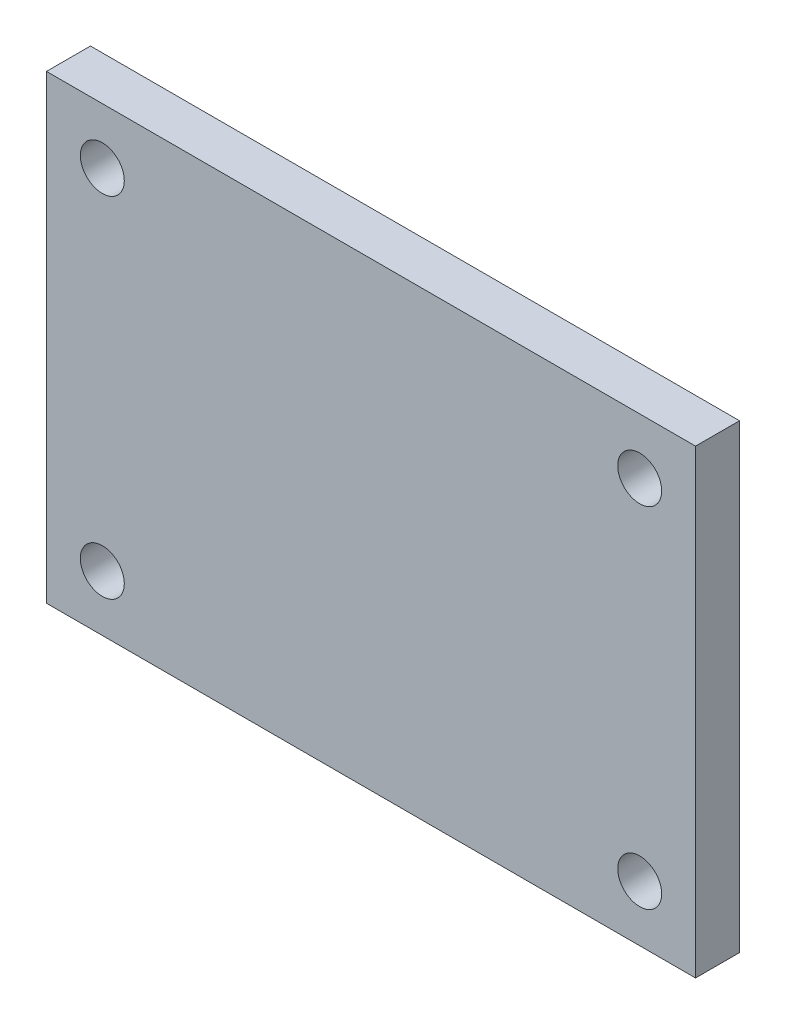
ISO-10303-21;
HEADER;
FILE_DESCRIPTION(('STEP AP214'),'2;1');
FILE_NAME('part.step','',(''),(''),'','','');
FILE_SCHEMA(('AUTOMOTIVE_DESIGN { 1 0 10303 214 1 1 1 1 }'));
ENDSEC;
DATA;
#1=APPLICATION_CONTEXT('core data for automotive mechanical design processes');
#2=APPLICATION_PROTOCOL_DEFINITION('international standard','automotive_design',2000,#1);
#3=PRODUCT_CONTEXT('',#1,'mechanical');
#4=PRODUCT('Part','Part','',(#3));
#5=PRODUCT_RELATED_PRODUCT_CATEGORY('part','',(#4));
#6=PRODUCT_DEFINITION_FORMATION('','',#4);
#7=PRODUCT_DEFINITION_CONTEXT('part definition',#1,'design');
#8=PRODUCT_DEFINITION('design','',#6,#7);
#9=PRODUCT_DEFINITION_SHAPE('','',#8);
#10=(LENGTH_UNIT() NAMED_UNIT(*) SI_UNIT(.MILLI.,.METRE.));
#11=(NAMED_UNIT(*) PLANE_ANGLE_UNIT() SI_UNIT($,.RADIAN.));
#12=(NAMED_UNIT(*) SI_UNIT($,.STERADIAN.) SOLID_ANGLE_UNIT());
#13=UNCERTAINTY_MEASURE_WITH_UNIT(LENGTH_MEASURE(1.E-05),#10,'distance_accuracy_value','');
#14=(GEOMETRIC_REPRESENTATION_CONTEXT(3) GLOBAL_UNCERTAINTY_ASSIGNED_CONTEXT((#13)) GLOBAL_UNIT_ASSIGNED_CONTEXT((#10,
#11,#12)) REPRESENTATION_CONTEXT('',''));
#15=CARTESIAN_POINT('',(0.,0.,0.));
#16=DIRECTION('',(0.,0.,1.));
#17=DIRECTION('',(1.,0.,0.));
#18=AXIS2_PLACEMENT_3D('',#15,#16,#17);
#19=CARTESIAN_POINT('',(0.,0.,3.2));
#20=DIRECTION('',(1.,0.,0.));
#21=DIRECTION('',(0.,0.,-1.));
#22=AXIS2_PLACEMENT_3D('',#19,#20,#21);
#23=PLANE('',#22);
#24=DIRECTION('',(0.,-1.,0.));
#25=VECTOR('',#24,1.);
#26=CARTESIAN_POINT('',(0.,0.,0.));
#27=LINE('',#26,#25);
#28=CARTESIAN_POINT('',(0.,33.528,0.));
#29=VERTEX_POINT('',#28);
#30=CARTESIAN_POINT('',(0.,0.,0.));
#31=VERTEX_POINT('',#30);
#32=EDGE_CURVE('E99',#29,#31,#27,.T.);
#33=ORIENTED_EDGE('',*,*,#32,.T.);
#34=DIRECTION('',(0.,0.,-1.));
#35=VECTOR('',#34,1.);
#36=CARTESIAN_POINT('',(0.,0.,3.2));
#37=LINE('',#36,#35);
#38=CARTESIAN_POINT('',(0.,0.,3.2));
#39=VERTEX_POINT('',#38);
#40=EDGE_CURVE('E11',#39,#31,#37,.T.);
#41=ORIENTED_EDGE('',*,*,#40,.F.);
#42=DIRECTION('',(0.,-1.,0.));
#43=VECTOR('',#42,1.);
#44=CARTESIAN_POINT('',(0.,0.,3.2));
#45=LINE('',#44,#43);
#46=CARTESIAN_POINT('',(0.,33.528,3.2));
#47=VERTEX_POINT('',#46);
#48=EDGE_CURVE('E87',#47,#39,#45,.T.);
#49=ORIENTED_EDGE('',*,*,#48,.F.);
#50=DIRECTION('',(0.,0.,-1.));
#51=VECTOR('',#50,1.);
#52=CARTESIAN_POINT('',(0.,33.528,3.2));
#53=LINE('',#52,#51);
#54=EDGE_CURVE('E95',#47,#29,#53,.T.);
#55=ORIENTED_EDGE('',*,*,#54,.T.);
#56=EDGE_LOOP('',(#33,#41,#49,#55));
#57=FACE_BOUND('',#56,.T.);
#58=ADVANCED_FACE('F36',(#57),#23,.F.);
#59=CARTESIAN_POINT('',(0.,0.,3.2));
#60=DIRECTION('',(0.,1.,0.));
#61=DIRECTION('',(0.,0.,1.));
#62=AXIS2_PLACEMENT_3D('',#59,#60,#61);
#63=PLANE('',#62);
#64=DIRECTION('',(1.,0.,0.));
#65=VECTOR('',#64,1.);
#66=CARTESIAN_POINT('',(0.,0.,0.));
#67=LINE('',#66,#65);
#68=CARTESIAN_POINT('',(47.244,0.,0.));
#69=VERTEX_POINT('',#68);
#70=EDGE_CURVE('E91',#31,#69,#67,.T.);
#71=ORIENTED_EDGE('',*,*,#70,.T.);
#72=DIRECTION('',(0.,0.,-1.));
#73=VECTOR('',#72,1.);
#74=CARTESIAN_POINT('',(47.244,0.,3.2));
#75=LINE('',#74,#73);
#76=CARTESIAN_POINT('',(47.244,0.,3.2));
#77=VERTEX_POINT('',#76);
#78=EDGE_CURVE('E44',#77,#69,#75,.T.);
#79=ORIENTED_EDGE('',*,*,#78,.F.);
#80=DIRECTION('',(1.,0.,0.));
#81=VECTOR('',#80,1.);
#82=CARTESIAN_POINT('',(0.,0.,3.2));
#83=LINE('',#82,#81);
#84=EDGE_CURVE('E82',#39,#77,#83,.T.);
#85=ORIENTED_EDGE('',*,*,#84,.F.);
#86=ORIENTED_EDGE('',*,*,#40,.T.);
#87=EDGE_LOOP('',(#71,#79,#85,#86));
#88=FACE_BOUND('',#87,.T.);
#89=ADVANCED_FACE('F90',(#88),#63,.F.);
#90=CARTESIAN_POINT('',(47.244,0.,3.2));
#91=DIRECTION('',(-1.,0.,0.));
#92=DIRECTION('',(0.,0.,1.));
#93=AXIS2_PLACEMENT_3D('',#90,#91,#92);
#94=PLANE('',#93);
#95=DIRECTION('',(0.,1.,0.));
#96=VECTOR('',#95,1.);
#97=CARTESIAN_POINT('',(47.244,0.,0.));
#98=LINE('',#97,#96);
#99=CARTESIAN_POINT('',(47.244,33.528,0.));
#100=VERTEX_POINT('',#99);
#101=EDGE_CURVE('E69',#69,#100,#98,.T.);
#102=ORIENTED_EDGE('',*,*,#101,.T.);
#103=DIRECTION('',(0.,0.,-1.));
#104=VECTOR('',#103,1.);
#105=CARTESIAN_POINT('',(47.244,33.528,3.2));
#106=LINE('',#105,#104);
#107=CARTESIAN_POINT('',(47.244,33.528,3.2));
#108=VERTEX_POINT('',#107);
#109=EDGE_CURVE('E92',#108,#100,#106,.T.);
#110=ORIENTED_EDGE('',*,*,#109,.F.);
#111=DIRECTION('',(0.,1.,0.));
#112=VECTOR('',#111,1.);
#113=CARTESIAN_POINT('',(47.244,0.,3.2));
#114=LINE('',#113,#112);
#115=EDGE_CURVE('E85',#77,#108,#114,.T.);
#116=ORIENTED_EDGE('',*,*,#115,.F.);
#117=ORIENTED_EDGE('',*,*,#78,.T.);
#118=EDGE_LOOP('',(#102,#110,#116,#117));
#119=FACE_BOUND('',#118,.T.);
#120=ADVANCED_FACE('F93',(#119),#94,.F.);
#121=CARTESIAN_POINT('',(0.,33.528,3.2));
#122=DIRECTION('',(0.,-1.,0.));
#123=DIRECTION('',(0.,0.,-1.));
#124=AXIS2_PLACEMENT_3D('',#121,#122,#123);
#125=PLANE('',#124);
#126=DIRECTION('',(-1.,0.,0.));
#127=VECTOR('',#126,1.);
#128=CARTESIAN_POINT('',(0.,33.528,0.));
#129=LINE('',#128,#127);
#130=EDGE_CURVE('E75',#100,#29,#129,.T.);
#131=ORIENTED_EDGE('',*,*,#130,.T.);
#132=ORIENTED_EDGE('',*,*,#54,.F.);
#133=DIRECTION('',(-1.,0.,0.));
#134=VECTOR('',#133,1.);
#135=CARTESIAN_POINT('',(0.,33.528,3.2));
#136=LINE('',#135,#134);
#137=EDGE_CURVE('E52',#108,#47,#136,.T.);
#138=ORIENTED_EDGE('',*,*,#137,.F.);
#139=ORIENTED_EDGE('',*,*,#109,.T.);
#140=EDGE_LOOP('',(#131,#132,#138,#139));
#141=FACE_BOUND('',#140,.T.);
#142=ADVANCED_FACE('F107',(#141),#125,.F.);
#143=CARTESIAN_POINT('',(0.,0.,3.2));
#144=DIRECTION('',(0.,0.,-1.));
#145=DIRECTION('',(-1.,0.,0.));
#146=AXIS2_PLACEMENT_3D('',#143,#144,#145);
#147=PLANE('',#146);
#148=CARTESIAN_POINT('',(4.064,4.064,3.2));
#149=DIRECTION('',(0.,0.,1.));
#150=DIRECTION('',(1.,0.,0.));
#151=AXIS2_PLACEMENT_3D('',#148,#149,#150);
#152=CIRCLE('',#151,1.6);
#153=CARTESIAN_POINT('',(5.664,4.064,3.2));
#154=VERTEX_POINT('',#153);
#155=EDGE_CURVE('E123',#154,#154,#152,.T.);
#156=ORIENTED_EDGE('',*,*,#155,.F.);
#157=EDGE_LOOP('',(#156));
#158=FACE_BOUND('',#157,.T.);
#159=CARTESIAN_POINT('',(43.18,4.064,3.2));
#160=DIRECTION('',(0.,0.,1.));
#161=DIRECTION('',(1.,0.,0.));
#162=AXIS2_PLACEMENT_3D('',#159,#160,#161);
#163=CIRCLE('',#162,1.6);
#164=CARTESIAN_POINT('',(44.78,4.064,3.2));
#165=VERTEX_POINT('',#164);
#166=EDGE_CURVE('E122',#165,#165,#163,.T.);
#167=ORIENTED_EDGE('',*,*,#166,.F.);
#168=EDGE_LOOP('',(#167));
#169=FACE_BOUND('',#168,.T.);
#170=CARTESIAN_POINT('',(43.18,29.464,3.2));
#171=DIRECTION('',(0.,0.,1.));
#172=DIRECTION('',(1.,0.,0.));
#173=AXIS2_PLACEMENT_3D('',#170,#171,#172);
#174=CIRCLE('',#173,1.6);
#175=CARTESIAN_POINT('',(44.78,29.464,3.2));
#176=VERTEX_POINT('',#175);
#177=EDGE_CURVE('E129',#176,#176,#174,.T.);
#178=ORIENTED_EDGE('',*,*,#177,.F.);
#179=EDGE_LOOP('',(#178));
#180=FACE_BOUND('',#179,.T.);
#181=CARTESIAN_POINT('',(4.064,29.464,3.2));
#182=DIRECTION('',(0.,0.,1.));
#183=DIRECTION('',(1.,0.,0.));
#184=AXIS2_PLACEMENT_3D('',#181,#182,#183);
#185=CIRCLE('',#184,1.6);
#186=CARTESIAN_POINT('',(5.664,29.464,3.2));
#187=VERTEX_POINT('',#186);
#188=EDGE_CURVE('E115',#187,#187,#185,.T.);
#189=ORIENTED_EDGE('',*,*,#188,.F.);
#190=EDGE_LOOP('',(#189));
#191=FACE_BOUND('',#190,.T.);
#192=ORIENTED_EDGE('',*,*,#48,.T.);
#193=ORIENTED_EDGE('',*,*,#84,.T.);
#194=ORIENTED_EDGE('',*,*,#115,.T.);
#195=ORIENTED_EDGE('',*,*,#137,.T.);
#196=EDGE_LOOP('',(#192,#193,#194,#195));
#197=FACE_BOUND('',#196,.T.);
#198=ADVANCED_FACE('F83',(#158,#169,#180,#191,#197),#147,.F.);
#199=CARTESIAN_POINT('',(0.,0.,0.));
#200=DIRECTION('',(0.,0.,-1.));
#201=DIRECTION('',(-1.,0.,0.));
#202=AXIS2_PLACEMENT_3D('',#199,#200,#201);
#203=PLANE('',#202);
#204=CARTESIAN_POINT('',(4.064,4.064,0.));
#205=DIRECTION('',(0.,0.,-1.));
#206=DIRECTION('',(-1.,0.,0.));
#207=AXIS2_PLACEMENT_3D('',#204,#205,#206);
#208=CIRCLE('',#207,1.6);
#209=CARTESIAN_POINT('',(2.464,4.064,0.));
#210=VERTEX_POINT('',#209);
#211=EDGE_CURVE('E119',#210,#210,#208,.F.);
#212=ORIENTED_EDGE('',*,*,#211,.T.);
#213=EDGE_LOOP('',(#212));
#214=FACE_BOUND('',#213,.T.);
#215=CARTESIAN_POINT('',(43.18,4.064,0.));
#216=DIRECTION('',(0.,0.,-1.));
#217=DIRECTION('',(-1.,0.,0.));
#218=AXIS2_PLACEMENT_3D('',#215,#216,#217);
#219=CIRCLE('',#218,1.6);
#220=CARTESIAN_POINT('',(41.58,4.064,0.));
#221=VERTEX_POINT('',#220);
#222=EDGE_CURVE('E126',#221,#221,#219,.F.);
#223=ORIENTED_EDGE('',*,*,#222,.T.);
#224=EDGE_LOOP('',(#223));
#225=FACE_BOUND('',#224,.T.);
#226=CARTESIAN_POINT('',(43.18,29.464,0.));
#227=DIRECTION('',(0.,0.,-1.));
#228=DIRECTION('',(-1.,0.,0.));
#229=AXIS2_PLACEMENT_3D('',#226,#227,#228);
#230=CIRCLE('',#229,1.6);
#231=CARTESIAN_POINT('',(41.58,29.464,0.));
#232=VERTEX_POINT('',#231);
#233=EDGE_CURVE('E118',#232,#232,#230,.F.);
#234=ORIENTED_EDGE('',*,*,#233,.T.);
#235=EDGE_LOOP('',(#234));
#236=FACE_BOUND('',#235,.T.);
#237=CARTESIAN_POINT('',(4.064,29.464,0.));
#238=DIRECTION('',(0.,0.,-1.));
#239=DIRECTION('',(-1.,0.,0.));
#240=AXIS2_PLACEMENT_3D('',#237,#238,#239);
#241=CIRCLE('',#240,1.6);
#242=CARTESIAN_POINT('',(2.464,29.464,0.));
#243=VERTEX_POINT('',#242);
#244=EDGE_CURVE('E102',#243,#243,#241,.F.);
#245=ORIENTED_EDGE('',*,*,#244,.T.);
#246=EDGE_LOOP('',(#245));
#247=FACE_BOUND('',#246,.T.);
#248=ORIENTED_EDGE('',*,*,#32,.F.);
#249=ORIENTED_EDGE('',*,*,#130,.F.);
#250=ORIENTED_EDGE('',*,*,#101,.F.);
#251=ORIENTED_EDGE('',*,*,#70,.F.);
#252=EDGE_LOOP('',(#248,#249,#250,#251));
#253=FACE_BOUND('',#252,.T.);
#254=ADVANCED_FACE('F110',(#214,#225,#236,#247,#253),#203,.T.);
#255=CARTESIAN_POINT('',(4.064,29.464,-4.5254833995939));
#256=DIRECTION('',(0.,0.,1.));
#257=DIRECTION('',(1.,0.,0.));
#258=AXIS2_PLACEMENT_3D('',#255,#256,#257);
#259=CYLINDRICAL_SURFACE('',#258,1.6);
#260=ORIENTED_EDGE('',*,*,#188,.T.);
#261=EDGE_LOOP('',(#260));
#262=FACE_BOUND('',#261,.T.);
#263=ORIENTED_EDGE('',*,*,#244,.F.);
#264=EDGE_LOOP('',(#263));
#265=FACE_BOUND('',#264,.T.);
#266=ADVANCED_FACE('F146',(#262,#265),#259,.F.);
#267=CARTESIAN_POINT('',(43.18,29.464,-4.5254833995939));
#268=DIRECTION('',(0.,0.,1.));
#269=DIRECTION('',(1.,0.,0.));
#270=AXIS2_PLACEMENT_3D('',#267,#268,#269);
#271=CYLINDRICAL_SURFACE('',#270,1.6);
#272=ORIENTED_EDGE('',*,*,#177,.T.);
#273=EDGE_LOOP('',(#272));
#274=FACE_BOUND('',#273,.T.);
#275=ORIENTED_EDGE('',*,*,#233,.F.);
#276=EDGE_LOOP('',(#275));
#277=FACE_BOUND('',#276,.T.);
#278=ADVANCED_FACE('F137',(#274,#277),#271,.F.);
#279=CARTESIAN_POINT('',(43.18,4.064,-4.5254833995939));
#280=DIRECTION('',(0.,0.,1.));
#281=DIRECTION('',(1.,0.,0.));
#282=AXIS2_PLACEMENT_3D('',#279,#280,#281);
#283=CYLINDRICAL_SURFACE('',#282,1.6);
#284=ORIENTED_EDGE('',*,*,#166,.T.);
#285=EDGE_LOOP('',(#284));
#286=FACE_BOUND('',#285,.T.);
#287=ORIENTED_EDGE('',*,*,#222,.F.);
#288=EDGE_LOOP('',(#287));
#289=FACE_BOUND('',#288,.T.);
#290=ADVANCED_FACE('F195',(#286,#289),#283,.F.);
#291=CARTESIAN_POINT('',(4.064,4.064,-4.5254833995939));
#292=DIRECTION('',(0.,0.,1.));
#293=DIRECTION('',(1.,0.,0.));
#294=AXIS2_PLACEMENT_3D('',#291,#292,#293);
#295=CYLINDRICAL_SURFACE('',#294,1.6);
#296=ORIENTED_EDGE('',*,*,#155,.T.);
#297=EDGE_LOOP('',(#296));
#298=FACE_BOUND('',#297,.T.);
#299=ORIENTED_EDGE('',*,*,#211,.F.);
#300=EDGE_LOOP('',(#299));
#301=FACE_BOUND('',#300,.T.);
#302=ADVANCED_FACE('F204',(#298,#301),#295,.F.);
#303=CLOSED_SHELL('',(#58,#89,#120,#142,#198,#254,#266,#278,#290,#302));
#304=MANIFOLD_SOLID_BREP('B2',#303);
#305=ADVANCED_BREP_SHAPE_REPRESENTATION('',(#18,#304),#14);
#306=SHAPE_DEFINITION_REPRESENTATION(#9,#305);
ENDSEC;
END-ISO-10303-21;
